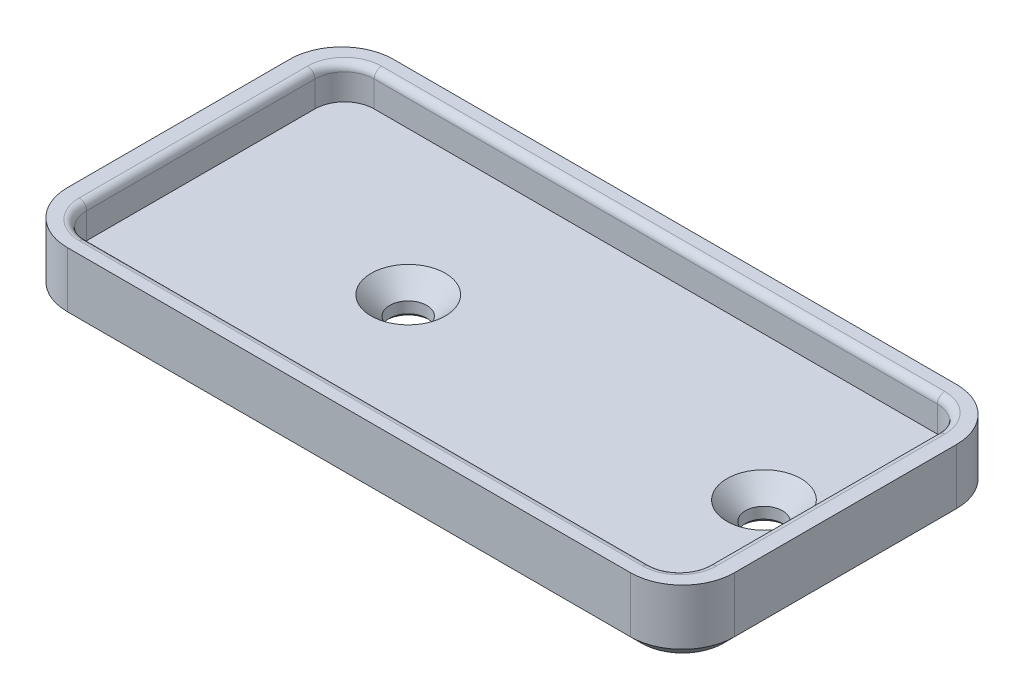
ISO-10303-21;
HEADER;
FILE_DESCRIPTION(('STEP AP214'),'2;1');
FILE_NAME('part.step','',(''),(''),'','','');
FILE_SCHEMA(('AUTOMOTIVE_DESIGN { 1 0 10303 214 1 1 1 1 }'));
ENDSEC;
DATA;
#1=APPLICATION_CONTEXT('core data for automotive mechanical design processes');
#2=APPLICATION_PROTOCOL_DEFINITION('international standard','automotive_design',2000,#1);
#3=PRODUCT_CONTEXT('',#1,'mechanical');
#4=PRODUCT('Part','Part','',(#3));
#5=PRODUCT_RELATED_PRODUCT_CATEGORY('part','',(#4));
#6=PRODUCT_DEFINITION_FORMATION('','',#4);
#7=PRODUCT_DEFINITION_CONTEXT('part definition',#1,'design');
#8=PRODUCT_DEFINITION('design','',#6,#7);
#9=PRODUCT_DEFINITION_SHAPE('','',#8);
#10=(LENGTH_UNIT() NAMED_UNIT(*) SI_UNIT(.MILLI.,.METRE.));
#11=(NAMED_UNIT(*) PLANE_ANGLE_UNIT() SI_UNIT($,.RADIAN.));
#12=(NAMED_UNIT(*) SI_UNIT($,.STERADIAN.) SOLID_ANGLE_UNIT());
#13=UNCERTAINTY_MEASURE_WITH_UNIT(LENGTH_MEASURE(1.E-05),#10,'distance_accuracy_value','');
#14=(GEOMETRIC_REPRESENTATION_CONTEXT(3) GLOBAL_UNCERTAINTY_ASSIGNED_CONTEXT((#13)) GLOBAL_UNIT_ASSIGNED_CONTEXT((#10,
#11,#12)) REPRESENTATION_CONTEXT('',''));
#15=CARTESIAN_POINT('',(0.,0.,0.));
#16=DIRECTION('',(0.,0.,1.));
#17=DIRECTION('',(1.,0.,0.));
#18=AXIS2_PLACEMENT_3D('',#15,#16,#17);
#19=CARTESIAN_POINT('',(45.,9.,22.));
#20=DIRECTION('',(-1.,0.,0.));
#21=DIRECTION('',(0.,0.,1.));
#22=AXIS2_PLACEMENT_3D('',#19,#20,#21);
#23=PLANE('',#22);
#24=DIRECTION('',(0.,-1.,0.));
#25=VECTOR('',#24,1.);
#26=CARTESIAN_POINT('',(45.,9.,15.));
#27=LINE('',#26,#25);
#28=CARTESIAN_POINT('',(45.,9.,15.));
#29=VERTEX_POINT('',#28);
#30=CARTESIAN_POINT('',(45.,1.5,15.));
#31=VERTEX_POINT('',#30);
#32=EDGE_CURVE('E252',#29,#31,#27,.T.);
#33=ORIENTED_EDGE('',*,*,#32,.T.);
#34=DIRECTION('',(0.,0.,-1.));
#35=VECTOR('',#34,1.);
#36=CARTESIAN_POINT('',(45.,1.5,-15.));
#37=LINE('',#36,#35);
#38=CARTESIAN_POINT('',(45.,1.5,-15.));
#39=VERTEX_POINT('',#38);
#40=EDGE_CURVE('E381',#31,#39,#37,.T.);
#41=ORIENTED_EDGE('',*,*,#40,.T.);
#42=DIRECTION('',(0.,-1.,0.));
#43=VECTOR('',#42,1.);
#44=CARTESIAN_POINT('',(45.,9.,-15.));
#45=LINE('',#44,#43);
#46=CARTESIAN_POINT('',(45.,9.,-15.));
#47=VERTEX_POINT('',#46);
#48=EDGE_CURVE('E254',#39,#47,#45,.F.);
#49=ORIENTED_EDGE('',*,*,#48,.T.);
#50=DIRECTION('',(0.,0.,-1.));
#51=VECTOR('',#50,1.);
#52=CARTESIAN_POINT('',(45.,9.,22.));
#53=LINE('',#52,#51);
#54=EDGE_CURVE('E803',#29,#47,#53,.T.);
#55=ORIENTED_EDGE('',*,*,#54,.F.);
#56=EDGE_LOOP('',(#33,#41,#49,#55));
#57=FACE_BOUND('',#56,.T.);
#58=ADVANCED_FACE('F45',(#57),#23,.F.);
#59=CARTESIAN_POINT('',(-45.,9.,-22.));
#60=DIRECTION('',(0.,0.,1.));
#61=DIRECTION('',(1.,0.,0.));
#62=AXIS2_PLACEMENT_3D('',#59,#60,#61);
#63=PLANE('',#62);
#64=DIRECTION('',(0.,-1.,0.));
#65=VECTOR('',#64,1.);
#66=CARTESIAN_POINT('',(38.,9.,-22.));
#67=LINE('',#66,#65);
#68=CARTESIAN_POINT('',(38.,9.,-22.));
#69=VERTEX_POINT('',#68);
#70=CARTESIAN_POINT('',(38.,1.5,-22.));
#71=VERTEX_POINT('',#70);
#72=EDGE_CURVE('E235',#69,#71,#67,.T.);
#73=ORIENTED_EDGE('',*,*,#72,.T.);
#74=DIRECTION('',(-1.,0.,0.));
#75=VECTOR('',#74,1.);
#76=CARTESIAN_POINT('',(-38.,1.5,-22.));
#77=LINE('',#76,#75);
#78=CARTESIAN_POINT('',(-38.,1.5,-22.));
#79=VERTEX_POINT('',#78);
#80=EDGE_CURVE('E377',#71,#79,#77,.T.);
#81=ORIENTED_EDGE('',*,*,#80,.T.);
#82=DIRECTION('',(0.,-1.,0.));
#83=VECTOR('',#82,1.);
#84=CARTESIAN_POINT('',(-38.,9.,-22.));
#85=LINE('',#84,#83);
#86=CARTESIAN_POINT('',(-38.,9.,-22.));
#87=VERTEX_POINT('',#86);
#88=EDGE_CURVE('E238',#79,#87,#85,.F.);
#89=ORIENTED_EDGE('',*,*,#88,.T.);
#90=DIRECTION('',(-1.,0.,0.));
#91=VECTOR('',#90,1.);
#92=CARTESIAN_POINT('',(-45.,9.,-22.));
#93=LINE('',#92,#91);
#94=EDGE_CURVE('E216',#69,#87,#93,.T.);
#95=ORIENTED_EDGE('',*,*,#94,.F.);
#96=EDGE_LOOP('',(#73,#81,#89,#95));
#97=FACE_BOUND('',#96,.T.);
#98=ADVANCED_FACE('F448',(#97),#63,.F.);
#99=CARTESIAN_POINT('',(-45.,9.,22.));
#100=DIRECTION('',(1.,0.,0.));
#101=DIRECTION('',(0.,0.,-1.));
#102=AXIS2_PLACEMENT_3D('',#99,#100,#101);
#103=PLANE('',#102);
#104=DIRECTION('',(0.,-1.,0.));
#105=VECTOR('',#104,1.);
#106=CARTESIAN_POINT('',(-45.,9.,-15.));
#107=LINE('',#106,#105);
#108=CARTESIAN_POINT('',(-45.,9.,-15.));
#109=VERTEX_POINT('',#108);
#110=CARTESIAN_POINT('',(-45.,1.5,-15.));
#111=VERTEX_POINT('',#110);
#112=EDGE_CURVE('E226',#109,#111,#107,.T.);
#113=ORIENTED_EDGE('',*,*,#112,.T.);
#114=DIRECTION('',(0.,0.,1.));
#115=VECTOR('',#114,1.);
#116=CARTESIAN_POINT('',(-45.,1.5,15.));
#117=LINE('',#116,#115);
#118=CARTESIAN_POINT('',(-45.,1.5,15.));
#119=VERTEX_POINT('',#118);
#120=EDGE_CURVE('E374',#111,#119,#117,.T.);
#121=ORIENTED_EDGE('',*,*,#120,.T.);
#122=DIRECTION('',(0.,-1.,0.));
#123=VECTOR('',#122,1.);
#124=CARTESIAN_POINT('',(-45.,9.,15.));
#125=LINE('',#124,#123);
#126=CARTESIAN_POINT('',(-45.,9.,15.));
#127=VERTEX_POINT('',#126);
#128=EDGE_CURVE('E229',#119,#127,#125,.F.);
#129=ORIENTED_EDGE('',*,*,#128,.T.);
#130=DIRECTION('',(0.,0.,1.));
#131=VECTOR('',#130,1.);
#132=CARTESIAN_POINT('',(-45.,9.,22.));
#133=LINE('',#132,#131);
#134=EDGE_CURVE('E213',#109,#127,#133,.T.);
#135=ORIENTED_EDGE('',*,*,#134,.F.);
#136=EDGE_LOOP('',(#113,#121,#129,#135));
#137=FACE_BOUND('',#136,.T.);
#138=ADVANCED_FACE('F225',(#137),#103,.F.);
#139=CARTESIAN_POINT('',(-45.,9.,22.));
#140=DIRECTION('',(0.,0.,-1.));
#141=DIRECTION('',(-1.,0.,0.));
#142=AXIS2_PLACEMENT_3D('',#139,#140,#141);
#143=PLANE('',#142);
#144=DIRECTION('',(0.,-1.,0.));
#145=VECTOR('',#144,1.);
#146=CARTESIAN_POINT('',(-38.,9.,22.));
#147=LINE('',#146,#145);
#148=CARTESIAN_POINT('',(-38.,9.,22.));
#149=VERTEX_POINT('',#148);
#150=CARTESIAN_POINT('',(-38.,1.5,22.));
#151=VERTEX_POINT('',#150);
#152=EDGE_CURVE('E250',#149,#151,#147,.T.);
#153=ORIENTED_EDGE('',*,*,#152,.T.);
#154=DIRECTION('',(1.,0.,0.));
#155=VECTOR('',#154,1.);
#156=CARTESIAN_POINT('',(38.,1.5,22.));
#157=LINE('',#156,#155);
#158=CARTESIAN_POINT('',(38.,1.5,22.));
#159=VERTEX_POINT('',#158);
#160=EDGE_CURVE('E61',#151,#159,#157,.T.);
#161=ORIENTED_EDGE('',*,*,#160,.T.);
#162=DIRECTION('',(0.,-1.,0.));
#163=VECTOR('',#162,1.);
#164=CARTESIAN_POINT('',(38.,9.,22.));
#165=LINE('',#164,#163);
#166=CARTESIAN_POINT('',(38.,9.,22.));
#167=VERTEX_POINT('',#166);
#168=EDGE_CURVE('E220',#159,#167,#165,.F.);
#169=ORIENTED_EDGE('',*,*,#168,.T.);
#170=DIRECTION('',(1.,0.,0.));
#171=VECTOR('',#170,1.);
#172=CARTESIAN_POINT('',(-45.,9.,22.));
#173=LINE('',#172,#171);
#174=EDGE_CURVE('E230',#149,#167,#173,.T.);
#175=ORIENTED_EDGE('',*,*,#174,.F.);
#176=EDGE_LOOP('',(#153,#161,#169,#175));
#177=FACE_BOUND('',#176,.T.);
#178=ADVANCED_FACE('F619',(#177),#143,.F.);
#179=CARTESIAN_POINT('',(0.,9.,0.));
#180=DIRECTION('',(0.,-1.,0.));
#181=DIRECTION('',(0.,0.,-1.));
#182=AXIS2_PLACEMENT_3D('',#179,#180,#181);
#183=PLANE('',#182);
#184=DIRECTION('',(-1.,0.,0.));
#185=VECTOR('',#184,1.);
#186=CARTESIAN_POINT('',(0.,9.,-20.4));
#187=LINE('',#186,#185);
#188=CARTESIAN_POINT('',(-38.,9.,-20.4));
#189=VERTEX_POINT('',#188);
#190=CARTESIAN_POINT('',(38.,9.,-20.4));
#191=VERTEX_POINT('',#190);
#192=EDGE_CURVE('E296',#189,#191,#187,.F.);
#193=ORIENTED_EDGE('',*,*,#192,.T.);
#194=CARTESIAN_POINT('',(38.,9.,-15.4));
#195=DIRECTION('',(0.,-1.,0.));
#196=DIRECTION('',(0.,0.,-1.));
#197=AXIS2_PLACEMENT_3D('',#194,#195,#196);
#198=CIRCLE('',#197,5.);
#199=CARTESIAN_POINT('',(43.,9.,-15.4));
#200=VERTEX_POINT('',#199);
#201=EDGE_CURVE('E310',#191,#200,#198,.T.);
#202=ORIENTED_EDGE('',*,*,#201,.T.);
#203=DIRECTION('',(0.,0.,-1.));
#204=VECTOR('',#203,1.);
#205=CARTESIAN_POINT('',(43.,9.,0.));
#206=LINE('',#205,#204);
#207=CARTESIAN_POINT('',(43.,9.,15.4));
#208=VERTEX_POINT('',#207);
#209=EDGE_CURVE('E308',#200,#208,#206,.F.);
#210=ORIENTED_EDGE('',*,*,#209,.T.);
#211=CARTESIAN_POINT('',(38.,9.,15.4));
#212=DIRECTION('',(0.,-1.,0.));
#213=DIRECTION('',(0.,0.,-1.));
#214=AXIS2_PLACEMENT_3D('',#211,#212,#213);
#215=CIRCLE('',#214,5.);
#216=CARTESIAN_POINT('',(38.,9.,20.4));
#217=VERTEX_POINT('',#216);
#218=EDGE_CURVE('E306',#208,#217,#215,.T.);
#219=ORIENTED_EDGE('',*,*,#218,.T.);
#220=DIRECTION('',(1.,0.,0.));
#221=VECTOR('',#220,1.);
#222=CARTESIAN_POINT('',(0.,9.,20.4));
#223=LINE('',#222,#221);
#224=CARTESIAN_POINT('',(-38.,9.,20.4));
#225=VERTEX_POINT('',#224);
#226=EDGE_CURVE('E304',#217,#225,#223,.F.);
#227=ORIENTED_EDGE('',*,*,#226,.T.);
#228=CARTESIAN_POINT('',(-38.,9.,15.4));
#229=DIRECTION('',(0.,-1.,0.));
#230=DIRECTION('',(0.,0.,-1.));
#231=AXIS2_PLACEMENT_3D('',#228,#229,#230);
#232=CIRCLE('',#231,5.);
#233=CARTESIAN_POINT('',(-43.,9.,15.4));
#234=VERTEX_POINT('',#233);
#235=EDGE_CURVE('E302',#225,#234,#232,.T.);
#236=ORIENTED_EDGE('',*,*,#235,.T.);
#237=DIRECTION('',(0.,0.,1.));
#238=VECTOR('',#237,1.);
#239=CARTESIAN_POINT('',(-43.,9.,0.));
#240=LINE('',#239,#238);
#241=CARTESIAN_POINT('',(-43.,9.,-15.4));
#242=VERTEX_POINT('',#241);
#243=EDGE_CURVE('E300',#234,#242,#240,.F.);
#244=ORIENTED_EDGE('',*,*,#243,.T.);
#245=CARTESIAN_POINT('',(-38.,9.,-15.4));
#246=DIRECTION('',(0.,-1.,0.));
#247=DIRECTION('',(0.,0.,-1.));
#248=AXIS2_PLACEMENT_3D('',#245,#246,#247);
#249=CIRCLE('',#248,5.);
#250=EDGE_CURVE('E298',#242,#189,#249,.T.);
#251=ORIENTED_EDGE('',*,*,#250,.T.);
#252=EDGE_LOOP('',(#193,#202,#210,#219,#227,#236,#244,#251));
#253=FACE_BOUND('',#252,.T.);
#254=ORIENTED_EDGE('',*,*,#94,.T.);
#255=CARTESIAN_POINT('',(-38.,9.,-15.));
#256=DIRECTION('',(0.,-1.,0.));
#257=DIRECTION('',(0.,0.,-1.));
#258=AXIS2_PLACEMENT_3D('',#255,#256,#257);
#259=CIRCLE('',#258,7.);
#260=EDGE_CURVE('E210',#87,#109,#259,.F.);
#261=ORIENTED_EDGE('',*,*,#260,.T.);
#262=ORIENTED_EDGE('',*,*,#134,.T.);
#263=CARTESIAN_POINT('',(-38.,9.,15.));
#264=DIRECTION('',(0.,-1.,0.));
#265=DIRECTION('',(0.,0.,-1.));
#266=AXIS2_PLACEMENT_3D('',#263,#264,#265);
#267=CIRCLE('',#266,7.);
#268=EDGE_CURVE('E221',#127,#149,#267,.F.);
#269=ORIENTED_EDGE('',*,*,#268,.T.);
#270=ORIENTED_EDGE('',*,*,#174,.T.);
#271=CARTESIAN_POINT('',(38.,9.,15.));
#272=DIRECTION('',(0.,-1.,0.));
#273=DIRECTION('',(0.,0.,-1.));
#274=AXIS2_PLACEMENT_3D('',#271,#272,#273);
#275=CIRCLE('',#274,7.);
#276=EDGE_CURVE('E244',#167,#29,#275,.F.);
#277=ORIENTED_EDGE('',*,*,#276,.T.);
#278=ORIENTED_EDGE('',*,*,#54,.T.);
#279=CARTESIAN_POINT('',(38.,9.,-15.));
#280=DIRECTION('',(0.,-1.,0.));
#281=DIRECTION('',(0.,0.,-1.));
#282=AXIS2_PLACEMENT_3D('',#279,#280,#281);
#283=CIRCLE('',#282,7.);
#284=EDGE_CURVE('E246',#47,#69,#283,.F.);
#285=ORIENTED_EDGE('',*,*,#284,.T.);
#286=EDGE_LOOP('',(#254,#261,#262,#269,#270,#277,#278,#285));
#287=FACE_BOUND('',#286,.T.);
#288=ADVANCED_FACE('F212',(#253,#287),#183,.F.);
#289=CARTESIAN_POINT('',(0.,0.,0.));
#290=DIRECTION('',(0.,-1.,0.));
#291=DIRECTION('',(0.,0.,-1.));
#292=AXIS2_PLACEMENT_3D('',#289,#290,#291);
#293=PLANE('',#292);
#294=CARTESIAN_POINT('',(34.,0.,0.));
#295=DIRECTION('',(0.,-1.,0.));
#296=DIRECTION('',(0.,0.,-1.));
#297=AXIS2_PLACEMENT_3D('',#294,#295,#296);
#298=CIRCLE('',#297,3.);
#299=CARTESIAN_POINT('',(34.,0.,-3.));
#300=VERTEX_POINT('',#299);
#301=EDGE_CURVE('E54',#300,#300,#298,.F.);
#302=ORIENTED_EDGE('',*,*,#301,.T.);
#303=EDGE_LOOP('',(#302));
#304=FACE_BOUND('',#303,.T.);
#305=CARTESIAN_POINT('',(-14.,0.,0.));
#306=DIRECTION('',(0.,-1.,0.));
#307=DIRECTION('',(0.,0.,-1.));
#308=AXIS2_PLACEMENT_3D('',#305,#306,#307);
#309=CIRCLE('',#308,3.);
#310=CARTESIAN_POINT('',(-14.,0.,-2.99999999999993));
#311=VERTEX_POINT('',#310);
#312=EDGE_CURVE('E409',#311,#311,#309,.F.);
#313=ORIENTED_EDGE('',*,*,#312,.T.);
#314=EDGE_LOOP('',(#313));
#315=FACE_BOUND('',#314,.T.);
#316=DIRECTION('',(-1.,0.,0.));
#317=VECTOR('',#316,1.);
#318=CARTESIAN_POINT('',(-38.,0.,20.5));
#319=LINE('',#318,#317);
#320=CARTESIAN_POINT('',(38.,0.,20.5));
#321=VERTEX_POINT('',#320);
#322=CARTESIAN_POINT('',(-38.,0.,20.5));
#323=VERTEX_POINT('',#322);
#324=EDGE_CURVE('E330',#321,#323,#319,.T.);
#325=ORIENTED_EDGE('',*,*,#324,.T.);
#326=CARTESIAN_POINT('',(-38.,0.,15.));
#327=DIRECTION('',(0.,-1.,0.));
#328=DIRECTION('',(0.,0.,-1.));
#329=AXIS2_PLACEMENT_3D('',#326,#327,#328);
#330=CIRCLE('',#329,5.5);
#331=CARTESIAN_POINT('',(-43.5,0.,15.));
#332=VERTEX_POINT('',#331);
#333=EDGE_CURVE('E368',#323,#332,#330,.T.);
#334=ORIENTED_EDGE('',*,*,#333,.T.);
#335=DIRECTION('',(0.,0.,-1.));
#336=VECTOR('',#335,1.);
#337=CARTESIAN_POINT('',(-43.5,0.,-15.));
#338=LINE('',#337,#336);
#339=CARTESIAN_POINT('',(-43.5,0.,-15.));
#340=VERTEX_POINT('',#339);
#341=EDGE_CURVE('E366',#332,#340,#338,.T.);
#342=ORIENTED_EDGE('',*,*,#341,.T.);
#343=CARTESIAN_POINT('',(-38.,0.,-15.));
#344=DIRECTION('',(0.,-1.,0.));
#345=DIRECTION('',(0.,0.,-1.));
#346=AXIS2_PLACEMENT_3D('',#343,#344,#345);
#347=CIRCLE('',#346,5.5);
#348=CARTESIAN_POINT('',(-38.,0.,-20.5));
#349=VERTEX_POINT('',#348);
#350=EDGE_CURVE('E364',#340,#349,#347,.T.);
#351=ORIENTED_EDGE('',*,*,#350,.T.);
#352=DIRECTION('',(1.,0.,0.));
#353=VECTOR('',#352,1.);
#354=CARTESIAN_POINT('',(38.,0.,-20.5));
#355=LINE('',#354,#353);
#356=CARTESIAN_POINT('',(38.,0.,-20.5));
#357=VERTEX_POINT('',#356);
#358=EDGE_CURVE('E362',#349,#357,#355,.T.);
#359=ORIENTED_EDGE('',*,*,#358,.T.);
#360=CARTESIAN_POINT('',(38.,0.,-15.));
#361=DIRECTION('',(0.,-1.,0.));
#362=DIRECTION('',(0.,0.,-1.));
#363=AXIS2_PLACEMENT_3D('',#360,#361,#362);
#364=CIRCLE('',#363,5.5);
#365=CARTESIAN_POINT('',(43.5,0.,-15.));
#366=VERTEX_POINT('',#365);
#367=EDGE_CURVE('E360',#357,#366,#364,.T.);
#368=ORIENTED_EDGE('',*,*,#367,.T.);
#369=DIRECTION('',(0.,0.,1.));
#370=VECTOR('',#369,1.);
#371=CARTESIAN_POINT('',(43.5,0.,15.));
#372=LINE('',#371,#370);
#373=CARTESIAN_POINT('',(43.5,0.,15.));
#374=VERTEX_POINT('',#373);
#375=EDGE_CURVE('E358',#366,#374,#372,.T.);
#376=ORIENTED_EDGE('',*,*,#375,.T.);
#377=CARTESIAN_POINT('',(38.,0.,15.));
#378=DIRECTION('',(0.,-1.,0.));
#379=DIRECTION('',(0.,0.,-1.));
#380=AXIS2_PLACEMENT_3D('',#377,#378,#379);
#381=CIRCLE('',#380,5.5);
#382=EDGE_CURVE('E356',#374,#321,#381,.T.);
#383=ORIENTED_EDGE('',*,*,#382,.T.);
#384=EDGE_LOOP('',(#325,#334,#342,#351,#359,#368,#376,#383));
#385=FACE_BOUND('',#384,.T.);
#386=ADVANCED_FACE('F414',(#304,#315,#385),#293,.T.);
#387=CARTESIAN_POINT('',(-38.,9.,-15.));
#388=DIRECTION('',(0.,-1.,0.));
#389=DIRECTION('',(0.,0.,-1.));
#390=AXIS2_PLACEMENT_3D('',#387,#388,#389);
#391=CYLINDRICAL_SURFACE('',#390,7.);
#392=ORIENTED_EDGE('',*,*,#88,.F.);
#393=CARTESIAN_POINT('',(-38.,1.5,-15.));
#394=DIRECTION('',(0.,-1.,0.));
#395=DIRECTION('',(0.,0.,-1.));
#396=AXIS2_PLACEMENT_3D('',#393,#394,#395);
#397=CIRCLE('',#396,7.);
#398=EDGE_CURVE('E234',#79,#111,#397,.F.);
#399=ORIENTED_EDGE('',*,*,#398,.T.);
#400=ORIENTED_EDGE('',*,*,#112,.F.);
#401=ORIENTED_EDGE('',*,*,#260,.F.);
#402=EDGE_LOOP('',(#392,#399,#400,#401));
#403=FACE_BOUND('',#402,.T.);
#404=ADVANCED_FACE('F232',(#403),#391,.T.);
#405=CARTESIAN_POINT('',(-38.,9.,15.));
#406=DIRECTION('',(0.,-1.,0.));
#407=DIRECTION('',(0.,0.,-1.));
#408=AXIS2_PLACEMENT_3D('',#405,#406,#407);
#409=CYLINDRICAL_SURFACE('',#408,7.);
#410=ORIENTED_EDGE('',*,*,#128,.F.);
#411=CARTESIAN_POINT('',(-38.,1.5,15.));
#412=DIRECTION('',(0.,-1.,0.));
#413=DIRECTION('',(0.,0.,-1.));
#414=AXIS2_PLACEMENT_3D('',#411,#412,#413);
#415=CIRCLE('',#414,7.);
#416=EDGE_CURVE('E371',#119,#151,#415,.F.);
#417=ORIENTED_EDGE('',*,*,#416,.T.);
#418=ORIENTED_EDGE('',*,*,#152,.F.);
#419=ORIENTED_EDGE('',*,*,#268,.F.);
#420=EDGE_LOOP('',(#410,#417,#418,#419));
#421=FACE_BOUND('',#420,.T.);
#422=ADVANCED_FACE('F460',(#421),#409,.T.);
#423=CARTESIAN_POINT('',(38.,9.,-15.));
#424=DIRECTION('',(0.,-1.,0.));
#425=DIRECTION('',(0.,0.,-1.));
#426=AXIS2_PLACEMENT_3D('',#423,#424,#425);
#427=CYLINDRICAL_SURFACE('',#426,7.);
#428=ORIENTED_EDGE('',*,*,#48,.F.);
#429=CARTESIAN_POINT('',(38.,1.5,-15.));
#430=DIRECTION('',(0.,-1.,0.));
#431=DIRECTION('',(0.,0.,-1.));
#432=AXIS2_PLACEMENT_3D('',#429,#430,#431);
#433=CIRCLE('',#432,7.);
#434=EDGE_CURVE('E379',#39,#71,#433,.F.);
#435=ORIENTED_EDGE('',*,*,#434,.T.);
#436=ORIENTED_EDGE('',*,*,#72,.F.);
#437=ORIENTED_EDGE('',*,*,#284,.F.);
#438=EDGE_LOOP('',(#428,#435,#436,#437));
#439=FACE_BOUND('',#438,.T.);
#440=ADVANCED_FACE('F463',(#439),#427,.T.);
#441=CARTESIAN_POINT('',(38.,9.,15.));
#442=DIRECTION('',(0.,-1.,0.));
#443=DIRECTION('',(0.,0.,-1.));
#444=AXIS2_PLACEMENT_3D('',#441,#442,#443);
#445=CYLINDRICAL_SURFACE('',#444,7.);
#446=ORIENTED_EDGE('',*,*,#168,.F.);
#447=CARTESIAN_POINT('',(38.,1.5,15.));
#448=DIRECTION('',(0.,-1.,0.));
#449=DIRECTION('',(0.,0.,-1.));
#450=AXIS2_PLACEMENT_3D('',#447,#448,#449);
#451=CIRCLE('',#450,7.);
#452=EDGE_CURVE('E68',#159,#31,#451,.F.);
#453=ORIENTED_EDGE('',*,*,#452,.T.);
#454=ORIENTED_EDGE('',*,*,#32,.F.);
#455=ORIENTED_EDGE('',*,*,#276,.F.);
#456=EDGE_LOOP('',(#446,#453,#454,#455));
#457=FACE_BOUND('',#456,.T.);
#458=ADVANCED_FACE('F467',(#457),#445,.T.);
#459=CARTESIAN_POINT('',(42.,4.5,19.4));
#460=DIRECTION('',(1.,0.,0.));
#461=DIRECTION('',(0.,0.,-1.));
#462=AXIS2_PLACEMENT_3D('',#459,#460,#461);
#463=PLANE('',#462);
#464=DIRECTION('',(0.,1.,0.));
#465=VECTOR('',#464,1.);
#466=CARTESIAN_POINT('',(42.,9.,15.4));
#467=LINE('',#466,#465);
#468=CARTESIAN_POINT('',(42.,4.5,15.4));
#469=VERTEX_POINT('',#468);
#470=CARTESIAN_POINT('',(42.,8.,15.4));
#471=VERTEX_POINT('',#470);
#472=EDGE_CURVE('E288',#469,#471,#467,.T.);
#473=ORIENTED_EDGE('',*,*,#472,.T.);
#474=DIRECTION('',(0.,0.,-1.));
#475=VECTOR('',#474,1.);
#476=CARTESIAN_POINT('',(42.,8.,19.4));
#477=LINE('',#476,#475);
#478=CARTESIAN_POINT('',(42.,8.,-15.4));
#479=VERTEX_POINT('',#478);
#480=EDGE_CURVE('E316',#471,#479,#477,.T.);
#481=ORIENTED_EDGE('',*,*,#480,.T.);
#482=DIRECTION('',(0.,1.,0.));
#483=VECTOR('',#482,1.);
#484=CARTESIAN_POINT('',(42.,4.5,-15.4));
#485=LINE('',#484,#483);
#486=CARTESIAN_POINT('',(42.,4.5,-15.4));
#487=VERTEX_POINT('',#486);
#488=EDGE_CURVE('E286',#479,#487,#485,.F.);
#489=ORIENTED_EDGE('',*,*,#488,.T.);
#490=DIRECTION('',(0.,0.,-1.));
#491=VECTOR('',#490,1.);
#492=CARTESIAN_POINT('',(42.,4.5,19.4));
#493=LINE('',#492,#491);
#494=EDGE_CURVE('E354',#469,#487,#493,.T.);
#495=ORIENTED_EDGE('',*,*,#494,.F.);
#496=EDGE_LOOP('',(#473,#481,#489,#495));
#497=FACE_BOUND('',#496,.T.);
#498=ADVANCED_FACE('F470',(#497),#463,.F.);
#499=CARTESIAN_POINT('',(-42.,4.5,19.4));
#500=DIRECTION('',(0.,0.,1.));
#501=DIRECTION('',(1.,0.,0.));
#502=AXIS2_PLACEMENT_3D('',#499,#500,#501);
#503=PLANE('',#502);
#504=DIRECTION('',(0.,1.,0.));
#505=VECTOR('',#504,1.);
#506=CARTESIAN_POINT('',(-38.,9.,19.4));
#507=LINE('',#506,#505);
#508=CARTESIAN_POINT('',(-38.,4.5,19.4));
#509=VERTEX_POINT('',#508);
#510=CARTESIAN_POINT('',(-38.,8.,19.4));
#511=VERTEX_POINT('',#510);
#512=EDGE_CURVE('E270',#509,#511,#507,.T.);
#513=ORIENTED_EDGE('',*,*,#512,.T.);
#514=DIRECTION('',(1.,0.,0.));
#515=VECTOR('',#514,1.);
#516=CARTESIAN_POINT('',(-42.,8.,19.4));
#517=LINE('',#516,#515);
#518=CARTESIAN_POINT('',(38.,8.,19.4));
#519=VERTEX_POINT('',#518);
#520=EDGE_CURVE('E320',#511,#519,#517,.T.);
#521=ORIENTED_EDGE('',*,*,#520,.T.);
#522=DIRECTION('',(0.,1.,0.));
#523=VECTOR('',#522,1.);
#524=CARTESIAN_POINT('',(38.,4.5,19.4));
#525=LINE('',#524,#523);
#526=CARTESIAN_POINT('',(38.,4.5,19.4));
#527=VERTEX_POINT('',#526);
#528=EDGE_CURVE('E268',#519,#527,#525,.F.);
#529=ORIENTED_EDGE('',*,*,#528,.T.);
#530=DIRECTION('',(1.,0.,0.));
#531=VECTOR('',#530,1.);
#532=CARTESIAN_POINT('',(-42.,4.5,19.4));
#533=LINE('',#532,#531);
#534=EDGE_CURVE('E805',#509,#527,#533,.T.);
#535=ORIENTED_EDGE('',*,*,#534,.F.);
#536=EDGE_LOOP('',(#513,#521,#529,#535));
#537=FACE_BOUND('',#536,.T.);
#538=ADVANCED_FACE('F818',(#537),#503,.F.);
#539=CARTESIAN_POINT('',(-42.,4.5,19.4));
#540=DIRECTION('',(-1.,0.,0.));
#541=DIRECTION('',(0.,0.,1.));
#542=AXIS2_PLACEMENT_3D('',#539,#540,#541);
#543=PLANE('',#542);
#544=DIRECTION('',(0.,1.,0.));
#545=VECTOR('',#544,1.);
#546=CARTESIAN_POINT('',(-42.,9.,-15.4));
#547=LINE('',#546,#545);
#548=CARTESIAN_POINT('',(-42.,4.5,-15.4));
#549=VERTEX_POINT('',#548);
#550=CARTESIAN_POINT('',(-42.,8.,-15.4));
#551=VERTEX_POINT('',#550);
#552=EDGE_CURVE('E273',#549,#551,#547,.T.);
#553=ORIENTED_EDGE('',*,*,#552,.T.);
#554=DIRECTION('',(0.,0.,1.));
#555=VECTOR('',#554,1.);
#556=CARTESIAN_POINT('',(-42.,8.,19.4));
#557=LINE('',#556,#555);
#558=CARTESIAN_POINT('',(-42.,8.,15.4));
#559=VERTEX_POINT('',#558);
#560=EDGE_CURVE('E324',#551,#559,#557,.T.);
#561=ORIENTED_EDGE('',*,*,#560,.T.);
#562=DIRECTION('',(0.,1.,0.));
#563=VECTOR('',#562,1.);
#564=CARTESIAN_POINT('',(-42.,4.5,15.4));
#565=LINE('',#564,#563);
#566=CARTESIAN_POINT('',(-42.,4.5,15.4));
#567=VERTEX_POINT('',#566);
#568=EDGE_CURVE('E276',#559,#567,#565,.F.);
#569=ORIENTED_EDGE('',*,*,#568,.T.);
#570=DIRECTION('',(0.,0.,1.));
#571=VECTOR('',#570,1.);
#572=CARTESIAN_POINT('',(-42.,4.5,19.4));
#573=LINE('',#572,#571);
#574=EDGE_CURVE('E813',#549,#567,#573,.T.);
#575=ORIENTED_EDGE('',*,*,#574,.F.);
#576=EDGE_LOOP('',(#553,#561,#569,#575));
#577=FACE_BOUND('',#576,.T.);
#578=ADVANCED_FACE('F609',(#577),#543,.F.);
#579=CARTESIAN_POINT('',(-42.,4.5,-19.4));
#580=DIRECTION('',(0.,0.,-1.));
#581=DIRECTION('',(-1.,0.,0.));
#582=AXIS2_PLACEMENT_3D('',#579,#580,#581);
#583=PLANE('',#582);
#584=DIRECTION('',(0.,1.,0.));
#585=VECTOR('',#584,1.);
#586=CARTESIAN_POINT('',(38.,9.,-19.4));
#587=LINE('',#586,#585);
#588=CARTESIAN_POINT('',(38.,4.5,-19.4));
#589=VERTEX_POINT('',#588);
#590=CARTESIAN_POINT('',(38.,8.,-19.4));
#591=VERTEX_POINT('',#590);
#592=EDGE_CURVE('E293',#589,#591,#587,.T.);
#593=ORIENTED_EDGE('',*,*,#592,.T.);
#594=DIRECTION('',(-1.,0.,0.));
#595=VECTOR('',#594,1.);
#596=CARTESIAN_POINT('',(-42.,8.,-19.4));
#597=LINE('',#596,#595);
#598=CARTESIAN_POINT('',(-38.,8.,-19.4));
#599=VERTEX_POINT('',#598);
#600=EDGE_CURVE('E328',#591,#599,#597,.T.);
#601=ORIENTED_EDGE('',*,*,#600,.T.);
#602=DIRECTION('',(0.,1.,0.));
#603=VECTOR('',#602,1.);
#604=CARTESIAN_POINT('',(-38.,4.5,-19.4));
#605=LINE('',#604,#603);
#606=CARTESIAN_POINT('',(-38.,4.5,-19.4));
#607=VERTEX_POINT('',#606);
#608=EDGE_CURVE('E291',#599,#607,#605,.F.);
#609=ORIENTED_EDGE('',*,*,#608,.T.);
#610=DIRECTION('',(-1.,0.,0.));
#611=VECTOR('',#610,1.);
#612=CARTESIAN_POINT('',(-42.,4.5,-19.4));
#613=LINE('',#612,#611);
#614=EDGE_CURVE('E815',#589,#607,#613,.T.);
#615=ORIENTED_EDGE('',*,*,#614,.F.);
#616=EDGE_LOOP('',(#593,#601,#609,#615));
#617=FACE_BOUND('',#616,.T.);
#618=ADVANCED_FACE('F596',(#617),#583,.F.);
#619=CARTESIAN_POINT('',(0.,4.5,0.));
#620=DIRECTION('',(0.,-1.,0.));
#621=DIRECTION('',(0.,0.,-1.));
#622=AXIS2_PLACEMENT_3D('',#619,#620,#621);
#623=PLANE('',#622);
#624=CARTESIAN_POINT('',(-14.,4.5,0.));
#625=DIRECTION('',(0.,-1.,0.));
#626=DIRECTION('',(0.,0.,-1.));
#627=AXIS2_PLACEMENT_3D('',#624,#625,#626);
#628=CIRCLE('',#627,5.00000000000002);
#629=CARTESIAN_POINT('',(-14.,4.5,-4.99999999999995));
#630=VERTEX_POINT('',#629);
#631=EDGE_CURVE('E262',#630,#630,#628,.T.);
#632=ORIENTED_EDGE('',*,*,#631,.T.);
#633=EDGE_LOOP('',(#632));
#634=FACE_BOUND('',#633,.T.);
#635=CARTESIAN_POINT('',(34.,4.5,0.));
#636=DIRECTION('',(0.,-1.,0.));
#637=DIRECTION('',(0.,0.,-1.));
#638=AXIS2_PLACEMENT_3D('',#635,#636,#637);
#639=CIRCLE('',#638,5.00000000000002);
#640=CARTESIAN_POINT('',(34.,4.5,-5.00000000000002));
#641=VERTEX_POINT('',#640);
#642=EDGE_CURVE('E259',#641,#641,#639,.T.);
#643=ORIENTED_EDGE('',*,*,#642,.T.);
#644=EDGE_LOOP('',(#643));
#645=FACE_BOUND('',#644,.T.);
#646=ORIENTED_EDGE('',*,*,#574,.T.);
#647=CARTESIAN_POINT('',(-38.,4.5,15.4));
#648=DIRECTION('',(0.,-1.,0.));
#649=DIRECTION('',(0.,0.,-1.));
#650=AXIS2_PLACEMENT_3D('',#647,#648,#649);
#651=CIRCLE('',#650,4.);
#652=EDGE_CURVE('E284',#567,#509,#651,.F.);
#653=ORIENTED_EDGE('',*,*,#652,.T.);
#654=ORIENTED_EDGE('',*,*,#534,.T.);
#655=CARTESIAN_POINT('',(38.,4.5,15.4));
#656=DIRECTION('',(0.,-1.,0.));
#657=DIRECTION('',(0.,0.,-1.));
#658=AXIS2_PLACEMENT_3D('',#655,#656,#657);
#659=CIRCLE('',#658,4.);
#660=EDGE_CURVE('E282',#527,#469,#659,.F.);
#661=ORIENTED_EDGE('',*,*,#660,.T.);
#662=ORIENTED_EDGE('',*,*,#494,.T.);
#663=CARTESIAN_POINT('',(38.,4.5,-15.4));
#664=DIRECTION('',(0.,-1.,0.));
#665=DIRECTION('',(0.,0.,-1.));
#666=AXIS2_PLACEMENT_3D('',#663,#664,#665);
#667=CIRCLE('',#666,4.);
#668=EDGE_CURVE('E280',#487,#589,#667,.F.);
#669=ORIENTED_EDGE('',*,*,#668,.T.);
#670=ORIENTED_EDGE('',*,*,#614,.T.);
#671=CARTESIAN_POINT('',(-38.,4.5,-15.4));
#672=DIRECTION('',(0.,-1.,0.));
#673=DIRECTION('',(0.,0.,-1.));
#674=AXIS2_PLACEMENT_3D('',#671,#672,#673);
#675=CIRCLE('',#674,4.);
#676=EDGE_CURVE('E278',#607,#549,#675,.F.);
#677=ORIENTED_EDGE('',*,*,#676,.T.);
#678=EDGE_LOOP('',(#646,#653,#654,#661,#662,#669,#670,#677));
#679=FACE_BOUND('',#678,.T.);
#680=ADVANCED_FACE('F744',(#634,#645,#679),#623,.F.);
#681=CARTESIAN_POINT('',(-14.,-5.5,0.));
#682=DIRECTION('',(0.,1.,0.));
#683=DIRECTION('',(0.,0.,1.));
#684=AXIS2_PLACEMENT_3D('',#681,#682,#683);
#685=CYLINDRICAL_SURFACE('',#684,2.5);
#686=CARTESIAN_POINT('',(-14.,0.500000000000013,0.));
#687=DIRECTION('',(0.,-1.,0.));
#688=DIRECTION('',(0.,0.,-1.));
#689=AXIS2_PLACEMENT_3D('',#686,#687,#688);
#690=CIRCLE('',#689,2.5);
#691=CARTESIAN_POINT('',(-14.,0.500000000000013,-2.49999999999993));
#692=VERTEX_POINT('',#691);
#693=EDGE_CURVE('E13',#692,#692,#690,.T.);
#694=ORIENTED_EDGE('',*,*,#693,.T.);
#695=EDGE_LOOP('',(#694));
#696=FACE_BOUND('',#695,.T.);
#697=CARTESIAN_POINT('',(-14.,1.99999999999999,0.));
#698=DIRECTION('',(0.,-1.,0.));
#699=DIRECTION('',(0.,0.,-1.));
#700=AXIS2_PLACEMENT_3D('',#697,#698,#699);
#701=CIRCLE('',#700,2.5);
#702=CARTESIAN_POINT('',(-14.,1.99999999999999,-2.49999999999993));
#703=VERTEX_POINT('',#702);
#704=EDGE_CURVE('E256',#703,#703,#701,.F.);
#705=ORIENTED_EDGE('',*,*,#704,.T.);
#706=EDGE_LOOP('',(#705));
#707=FACE_BOUND('',#706,.T.);
#708=ADVANCED_FACE('F427',(#696,#707),#685,.F.);
#709=CARTESIAN_POINT('',(34.,-5.5,0.));
#710=DIRECTION('',(0.,1.,0.));
#711=DIRECTION('',(0.,0.,1.));
#712=AXIS2_PLACEMENT_3D('',#709,#710,#711);
#713=CYLINDRICAL_SURFACE('',#712,2.5);
#714=CARTESIAN_POINT('',(34.,0.500000000000009,0.));
#715=DIRECTION('',(0.,-1.,0.));
#716=DIRECTION('',(0.,0.,-1.));
#717=AXIS2_PLACEMENT_3D('',#714,#715,#716);
#718=CIRCLE('',#717,2.5);
#719=CARTESIAN_POINT('',(34.,0.500000000000009,-2.5));
#720=VERTEX_POINT('',#719);
#721=EDGE_CURVE('E385',#720,#720,#718,.T.);
#722=ORIENTED_EDGE('',*,*,#721,.T.);
#723=EDGE_LOOP('',(#722));
#724=FACE_BOUND('',#723,.T.);
#725=CARTESIAN_POINT('',(34.,1.99999999999999,0.));
#726=DIRECTION('',(0.,-1.,0.));
#727=DIRECTION('',(0.,0.,-1.));
#728=AXIS2_PLACEMENT_3D('',#725,#726,#727);
#729=CIRCLE('',#728,2.5);
#730=CARTESIAN_POINT('',(34.,1.99999999999999,-2.5));
#731=VERTEX_POINT('',#730);
#732=EDGE_CURVE('E265',#731,#731,#729,.F.);
#733=ORIENTED_EDGE('',*,*,#732,.T.);
#734=EDGE_LOOP('',(#733));
#735=FACE_BOUND('',#734,.T.);
#736=ADVANCED_FACE('F423',(#724,#735),#713,.F.);
#737=CARTESIAN_POINT('',(-14.,1.99999999999999,0.));
#738=DIRECTION('',(0.,1.,0.));
#739=DIRECTION('',(0.,0.,1.));
#740=AXIS2_PLACEMENT_3D('',#737,#738,#739);
#741=CONICAL_SURFACE('',#740,2.5,0.785398163397449);
#742=ORIENTED_EDGE('',*,*,#631,.F.);
#743=EDGE_LOOP('',(#742));
#744=FACE_BOUND('',#743,.T.);
#745=ORIENTED_EDGE('',*,*,#704,.F.);
#746=EDGE_LOOP('',(#745));
#747=FACE_BOUND('',#746,.T.);
#748=ADVANCED_FACE('F426',(#744,#747),#741,.F.);
#749=CARTESIAN_POINT('',(34.,1.99999999999999,0.));
#750=DIRECTION('',(0.,1.,0.));
#751=DIRECTION('',(0.,0.,1.));
#752=AXIS2_PLACEMENT_3D('',#749,#750,#751);
#753=CONICAL_SURFACE('',#752,2.5,0.785398163397449);
#754=ORIENTED_EDGE('',*,*,#642,.F.);
#755=EDGE_LOOP('',(#754));
#756=FACE_BOUND('',#755,.T.);
#757=ORIENTED_EDGE('',*,*,#732,.F.);
#758=EDGE_LOOP('',(#757));
#759=FACE_BOUND('',#758,.T.);
#760=ADVANCED_FACE('F431',(#756,#759),#753,.F.);
#761=CARTESIAN_POINT('',(-38.,4.5,15.4));
#762=DIRECTION('',(0.,-1.,0.));
#763=DIRECTION('',(0.,0.,-1.));
#764=AXIS2_PLACEMENT_3D('',#761,#762,#763);
#765=CYLINDRICAL_SURFACE('',#764,4.);
#766=ORIENTED_EDGE('',*,*,#568,.F.);
#767=CARTESIAN_POINT('',(-38.,8.,15.4));
#768=DIRECTION('',(0.,-1.,0.));
#769=DIRECTION('',(0.,0.,-1.));
#770=AXIS2_PLACEMENT_3D('',#767,#768,#769);
#771=CIRCLE('',#770,4.);
#772=EDGE_CURVE('E322',#559,#511,#771,.F.);
#773=ORIENTED_EDGE('',*,*,#772,.T.);
#774=ORIENTED_EDGE('',*,*,#512,.F.);
#775=ORIENTED_EDGE('',*,*,#652,.F.);
#776=EDGE_LOOP('',(#766,#773,#774,#775));
#777=FACE_BOUND('',#776,.T.);
#778=ADVANCED_FACE('F433',(#777),#765,.F.);
#779=CARTESIAN_POINT('',(38.,4.5,15.4));
#780=DIRECTION('',(0.,-1.,0.));
#781=DIRECTION('',(0.,0.,-1.));
#782=AXIS2_PLACEMENT_3D('',#779,#780,#781);
#783=CYLINDRICAL_SURFACE('',#782,4.);
#784=ORIENTED_EDGE('',*,*,#528,.F.);
#785=CARTESIAN_POINT('',(38.,8.,15.4));
#786=DIRECTION('',(0.,-1.,0.));
#787=DIRECTION('',(0.,0.,-1.));
#788=AXIS2_PLACEMENT_3D('',#785,#786,#787);
#789=CIRCLE('',#788,4.);
#790=EDGE_CURVE('E318',#519,#471,#789,.F.);
#791=ORIENTED_EDGE('',*,*,#790,.T.);
#792=ORIENTED_EDGE('',*,*,#472,.F.);
#793=ORIENTED_EDGE('',*,*,#660,.F.);
#794=EDGE_LOOP('',(#784,#791,#792,#793));
#795=FACE_BOUND('',#794,.T.);
#796=ADVANCED_FACE('F440',(#795),#783,.F.);
#797=CARTESIAN_POINT('',(38.,4.5,-15.4));
#798=DIRECTION('',(0.,-1.,0.));
#799=DIRECTION('',(0.,0.,-1.));
#800=AXIS2_PLACEMENT_3D('',#797,#798,#799);
#801=CYLINDRICAL_SURFACE('',#800,4.);
#802=ORIENTED_EDGE('',*,*,#488,.F.);
#803=CARTESIAN_POINT('',(38.,8.,-15.4));
#804=DIRECTION('',(0.,-1.,0.));
#805=DIRECTION('',(0.,0.,-1.));
#806=AXIS2_PLACEMENT_3D('',#803,#804,#805);
#807=CIRCLE('',#806,4.);
#808=EDGE_CURVE('E313',#479,#591,#807,.F.);
#809=ORIENTED_EDGE('',*,*,#808,.T.);
#810=ORIENTED_EDGE('',*,*,#592,.F.);
#811=ORIENTED_EDGE('',*,*,#668,.F.);
#812=EDGE_LOOP('',(#802,#809,#810,#811));
#813=FACE_BOUND('',#812,.T.);
#814=ADVANCED_FACE('F558',(#813),#801,.F.);
#815=CARTESIAN_POINT('',(-38.,4.5,-15.4));
#816=DIRECTION('',(0.,-1.,0.));
#817=DIRECTION('',(0.,0.,-1.));
#818=AXIS2_PLACEMENT_3D('',#815,#816,#817);
#819=CYLINDRICAL_SURFACE('',#818,4.);
#820=ORIENTED_EDGE('',*,*,#608,.F.);
#821=CARTESIAN_POINT('',(-38.,8.,-15.4));
#822=DIRECTION('',(0.,-1.,0.));
#823=DIRECTION('',(0.,0.,-1.));
#824=AXIS2_PLACEMENT_3D('',#821,#822,#823);
#825=CIRCLE('',#824,4.);
#826=EDGE_CURVE('E326',#599,#551,#825,.F.);
#827=ORIENTED_EDGE('',*,*,#826,.T.);
#828=ORIENTED_EDGE('',*,*,#552,.F.);
#829=ORIENTED_EDGE('',*,*,#676,.F.);
#830=EDGE_LOOP('',(#820,#827,#828,#829));
#831=FACE_BOUND('',#830,.T.);
#832=ADVANCED_FACE('F527',(#831),#819,.F.);
#833=CARTESIAN_POINT('',(-38.,8.,15.4));
#834=DIRECTION('',(0.,-1.,0.));
#835=DIRECTION('',(0.,0.,-1.));
#836=AXIS2_PLACEMENT_3D('',#833,#834,#835);
#837=TOROIDAL_SURFACE('',#836,5.,1.);
#838=CARTESIAN_POINT('',(-38.,8.,20.4));
#839=DIRECTION('',(1.,0.,0.));
#840=DIRECTION('',(0.,0.,-1.));
#841=AXIS2_PLACEMENT_3D('',#838,#839,#840);
#842=CIRCLE('',#841,1.);
#843=EDGE_CURVE('E348',#511,#225,#842,.T.);
#844=ORIENTED_EDGE('',*,*,#843,.F.);
#845=ORIENTED_EDGE('',*,*,#772,.F.);
#846=CARTESIAN_POINT('',(-43.,8.,15.4));
#847=DIRECTION('',(0.,0.,-1.));
#848=DIRECTION('',(-1.,0.,0.));
#849=AXIS2_PLACEMENT_3D('',#846,#847,#848);
#850=CIRCLE('',#849,1.);
#851=EDGE_CURVE('E351',#234,#559,#850,.T.);
#852=ORIENTED_EDGE('',*,*,#851,.F.);
#853=ORIENTED_EDGE('',*,*,#235,.F.);
#854=EDGE_LOOP('',(#844,#845,#852,#853));
#855=FACE_BOUND('',#854,.T.);
#856=ADVANCED_FACE('F523',(#855),#837,.T.);
#857=CARTESIAN_POINT('',(-43.,8.,19.4));
#858=DIRECTION('',(0.,0.,1.));
#859=DIRECTION('',(1.,0.,0.));
#860=AXIS2_PLACEMENT_3D('',#857,#858,#859);
#861=CYLINDRICAL_SURFACE('',#860,1.);
#862=ORIENTED_EDGE('',*,*,#851,.T.);
#863=ORIENTED_EDGE('',*,*,#560,.F.);
#864=CARTESIAN_POINT('',(-43.,8.,-15.4));
#865=DIRECTION('',(0.,0.,-1.));
#866=DIRECTION('',(-1.,0.,0.));
#867=AXIS2_PLACEMENT_3D('',#864,#865,#866);
#868=CIRCLE('',#867,1.);
#869=EDGE_CURVE('E345',#242,#551,#868,.T.);
#870=ORIENTED_EDGE('',*,*,#869,.F.);
#871=ORIENTED_EDGE('',*,*,#243,.F.);
#872=EDGE_LOOP('',(#862,#863,#870,#871));
#873=FACE_BOUND('',#872,.T.);
#874=ADVANCED_FACE('F526',(#873),#861,.T.);
#875=CARTESIAN_POINT('',(-42.,8.,20.4));
#876=DIRECTION('',(1.,0.,0.));
#877=DIRECTION('',(0.,0.,-1.));
#878=AXIS2_PLACEMENT_3D('',#875,#876,#877);
#879=CYLINDRICAL_SURFACE('',#878,1.);
#880=ORIENTED_EDGE('',*,*,#843,.T.);
#881=ORIENTED_EDGE('',*,*,#226,.F.);
#882=CARTESIAN_POINT('',(38.,8.,20.4));
#883=DIRECTION('',(1.,0.,0.));
#884=DIRECTION('',(0.,0.,-1.));
#885=AXIS2_PLACEMENT_3D('',#882,#883,#884);
#886=CIRCLE('',#885,1.);
#887=EDGE_CURVE('E342',#519,#217,#886,.T.);
#888=ORIENTED_EDGE('',*,*,#887,.F.);
#889=ORIENTED_EDGE('',*,*,#520,.F.);
#890=EDGE_LOOP('',(#880,#881,#888,#889));
#891=FACE_BOUND('',#890,.T.);
#892=ADVANCED_FACE('F531',(#891),#879,.T.);
#893=CARTESIAN_POINT('',(-38.,8.,-15.4));
#894=DIRECTION('',(0.,-1.,0.));
#895=DIRECTION('',(0.,0.,-1.));
#896=AXIS2_PLACEMENT_3D('',#893,#894,#895);
#897=TOROIDAL_SURFACE('',#896,5.,1.);
#898=ORIENTED_EDGE('',*,*,#869,.T.);
#899=ORIENTED_EDGE('',*,*,#826,.F.);
#900=CARTESIAN_POINT('',(-38.,8.,-20.4));
#901=DIRECTION('',(1.,0.,0.));
#902=DIRECTION('',(0.,0.,-1.));
#903=AXIS2_PLACEMENT_3D('',#900,#901,#902);
#904=CIRCLE('',#903,1.);
#905=EDGE_CURVE('E339',#189,#599,#904,.T.);
#906=ORIENTED_EDGE('',*,*,#905,.F.);
#907=ORIENTED_EDGE('',*,*,#250,.F.);
#908=EDGE_LOOP('',(#898,#899,#906,#907));
#909=FACE_BOUND('',#908,.T.);
#910=ADVANCED_FACE('F535',(#909),#897,.T.);
#911=CARTESIAN_POINT('',(38.,8.,15.4));
#912=DIRECTION('',(0.,-1.,0.));
#913=DIRECTION('',(0.,0.,-1.));
#914=AXIS2_PLACEMENT_3D('',#911,#912,#913);
#915=TOROIDAL_SURFACE('',#914,5.,1.);
#916=ORIENTED_EDGE('',*,*,#887,.T.);
#917=ORIENTED_EDGE('',*,*,#218,.F.);
#918=CARTESIAN_POINT('',(43.,8.,15.4));
#919=DIRECTION('',(0.,0.,-1.));
#920=DIRECTION('',(-1.,0.,0.));
#921=AXIS2_PLACEMENT_3D('',#918,#919,#920);
#922=CIRCLE('',#921,1.);
#923=EDGE_CURVE('E336',#471,#208,#922,.T.);
#924=ORIENTED_EDGE('',*,*,#923,.F.);
#925=ORIENTED_EDGE('',*,*,#790,.F.);
#926=EDGE_LOOP('',(#916,#917,#924,#925));
#927=FACE_BOUND('',#926,.T.);
#928=ADVANCED_FACE('F539',(#927),#915,.T.);
#929=CARTESIAN_POINT('',(-42.,8.,-20.4));
#930=DIRECTION('',(-1.,0.,0.));
#931=DIRECTION('',(0.,0.,1.));
#932=AXIS2_PLACEMENT_3D('',#929,#930,#931);
#933=CYLINDRICAL_SURFACE('',#932,1.);
#934=ORIENTED_EDGE('',*,*,#905,.T.);
#935=ORIENTED_EDGE('',*,*,#600,.F.);
#936=CARTESIAN_POINT('',(38.,8.,-20.4));
#937=DIRECTION('',(1.,0.,0.));
#938=DIRECTION('',(0.,0.,-1.));
#939=AXIS2_PLACEMENT_3D('',#936,#937,#938);
#940=CIRCLE('',#939,1.);
#941=EDGE_CURVE('E333',#191,#591,#940,.T.);
#942=ORIENTED_EDGE('',*,*,#941,.F.);
#943=ORIENTED_EDGE('',*,*,#192,.F.);
#944=EDGE_LOOP('',(#934,#935,#942,#943));
#945=FACE_BOUND('',#944,.T.);
#946=ADVANCED_FACE('F543',(#945),#933,.T.);
#947=CARTESIAN_POINT('',(43.,8.,19.4));
#948=DIRECTION('',(0.,0.,-1.));
#949=DIRECTION('',(-1.,0.,0.));
#950=AXIS2_PLACEMENT_3D('',#947,#948,#949);
#951=CYLINDRICAL_SURFACE('',#950,1.);
#952=ORIENTED_EDGE('',*,*,#923,.T.);
#953=ORIENTED_EDGE('',*,*,#209,.F.);
#954=CARTESIAN_POINT('',(43.,8.,-15.4));
#955=DIRECTION('',(0.,0.,-1.));
#956=DIRECTION('',(-1.,0.,0.));
#957=AXIS2_PLACEMENT_3D('',#954,#955,#956);
#958=CIRCLE('',#957,1.);
#959=EDGE_CURVE('E331',#479,#200,#958,.T.);
#960=ORIENTED_EDGE('',*,*,#959,.F.);
#961=ORIENTED_EDGE('',*,*,#480,.F.);
#962=EDGE_LOOP('',(#952,#953,#960,#961));
#963=FACE_BOUND('',#962,.T.);
#964=ADVANCED_FACE('F547',(#963),#951,.T.);
#965=CARTESIAN_POINT('',(38.,8.,-15.4));
#966=DIRECTION('',(0.,-1.,0.));
#967=DIRECTION('',(0.,0.,-1.));
#968=AXIS2_PLACEMENT_3D('',#965,#966,#967);
#969=TOROIDAL_SURFACE('',#968,5.,1.);
#970=ORIENTED_EDGE('',*,*,#941,.T.);
#971=ORIENTED_EDGE('',*,*,#808,.F.);
#972=ORIENTED_EDGE('',*,*,#959,.T.);
#973=ORIENTED_EDGE('',*,*,#201,.F.);
#974=EDGE_LOOP('',(#970,#971,#972,#973));
#975=FACE_BOUND('',#974,.T.);
#976=ADVANCED_FACE('F551',(#975),#969,.T.);
#977=CARTESIAN_POINT('',(38.,0.,-15.));
#978=DIRECTION('',(0.,1.,0.));
#979=DIRECTION('',(0.,0.,1.));
#980=AXIS2_PLACEMENT_3D('',#977,#978,#979);
#981=CONICAL_SURFACE('',#980,5.5,0.785398163397449);
#982=DIRECTION('',(0.,-0.707106781186547,0.707106781186548));
#983=VECTOR('',#982,1.);
#984=CARTESIAN_POINT('',(38.,1.5,-22.));
#985=LINE('',#984,#983);
#986=EDGE_CURVE('E402',#71,#357,#985,.T.);
#987=ORIENTED_EDGE('',*,*,#986,.F.);
#988=ORIENTED_EDGE('',*,*,#434,.F.);
#989=DIRECTION('',(0.707106781186548,0.707106781186547,0.));
#990=VECTOR('',#989,1.);
#991=CARTESIAN_POINT('',(43.5,0.,-15.));
#992=LINE('',#991,#990);
#993=EDGE_CURVE('E334',#366,#39,#992,.T.);
#994=ORIENTED_EDGE('',*,*,#993,.F.);
#995=ORIENTED_EDGE('',*,*,#367,.F.);
#996=EDGE_LOOP('',(#987,#988,#994,#995));
#997=FACE_BOUND('',#996,.T.);
#998=ADVANCED_FACE('F481',(#997),#981,.T.);
#999=CARTESIAN_POINT('',(45.,1.5,22.));
#1000=DIRECTION('',(0.707106781186547,-0.707106781186548,0.));
#1001=DIRECTION('',(0.,0.,1.));
#1002=AXIS2_PLACEMENT_3D('',#999,#1000,#1001);
#1003=PLANE('',#1002);
#1004=ORIENTED_EDGE('',*,*,#993,.T.);
#1005=ORIENTED_EDGE('',*,*,#40,.F.);
#1006=DIRECTION('',(0.707106781186548,0.707106781186547,0.));
#1007=VECTOR('',#1006,1.);
#1008=CARTESIAN_POINT('',(43.5,0.,15.));
#1009=LINE('',#1008,#1007);
#1010=EDGE_CURVE('E399',#374,#31,#1009,.T.);
#1011=ORIENTED_EDGE('',*,*,#1010,.F.);
#1012=ORIENTED_EDGE('',*,*,#375,.F.);
#1013=EDGE_LOOP('',(#1004,#1005,#1011,#1012));
#1014=FACE_BOUND('',#1013,.T.);
#1015=ADVANCED_FACE('F486',(#1014),#1003,.T.);
#1016=CARTESIAN_POINT('',(-45.,1.5,-22.));
#1017=DIRECTION('',(0.,-0.707106781186548,-0.707106781186547));
#1018=DIRECTION('',(1.,0.,0.));
#1019=AXIS2_PLACEMENT_3D('',#1016,#1017,#1018);
#1020=PLANE('',#1019);
#1021=ORIENTED_EDGE('',*,*,#986,.T.);
#1022=ORIENTED_EDGE('',*,*,#358,.F.);
#1023=DIRECTION('',(0.,-0.707106781186547,0.707106781186548));
#1024=VECTOR('',#1023,1.);
#1025=CARTESIAN_POINT('',(-38.,1.5,-22.));
#1026=LINE('',#1025,#1024);
#1027=EDGE_CURVE('E396',#79,#349,#1026,.T.);
#1028=ORIENTED_EDGE('',*,*,#1027,.F.);
#1029=ORIENTED_EDGE('',*,*,#80,.F.);
#1030=EDGE_LOOP('',(#1021,#1022,#1028,#1029));
#1031=FACE_BOUND('',#1030,.T.);
#1032=ADVANCED_FACE('F491',(#1031),#1020,.T.);
#1033=CARTESIAN_POINT('',(38.,0.,15.));
#1034=DIRECTION('',(0.,1.,0.));
#1035=DIRECTION('',(0.,0.,1.));
#1036=AXIS2_PLACEMENT_3D('',#1033,#1034,#1035);
#1037=CONICAL_SURFACE('',#1036,5.5,0.785398163397449);
#1038=ORIENTED_EDGE('',*,*,#1010,.T.);
#1039=ORIENTED_EDGE('',*,*,#452,.F.);
#1040=DIRECTION('',(0.,0.707106781186547,0.707106781186548));
#1041=VECTOR('',#1040,1.);
#1042=CARTESIAN_POINT('',(38.,0.,20.5));
#1043=LINE('',#1042,#1041);
#1044=EDGE_CURVE('E393',#321,#159,#1043,.T.);
#1045=ORIENTED_EDGE('',*,*,#1044,.F.);
#1046=ORIENTED_EDGE('',*,*,#382,.F.);
#1047=EDGE_LOOP('',(#1038,#1039,#1045,#1046));
#1048=FACE_BOUND('',#1047,.T.);
#1049=ADVANCED_FACE('F496',(#1048),#1037,.T.);
#1050=CARTESIAN_POINT('',(-38.,0.,-15.));
#1051=DIRECTION('',(0.,1.,0.));
#1052=DIRECTION('',(0.,0.,1.));
#1053=AXIS2_PLACEMENT_3D('',#1050,#1051,#1052);
#1054=CONICAL_SURFACE('',#1053,5.5,0.785398163397449);
#1055=ORIENTED_EDGE('',*,*,#1027,.T.);
#1056=ORIENTED_EDGE('',*,*,#350,.F.);
#1057=DIRECTION('',(0.707106781186548,-0.707106781186547,0.));
#1058=VECTOR('',#1057,1.);
#1059=CARTESIAN_POINT('',(-45.,1.5,-15.));
#1060=LINE('',#1059,#1058);
#1061=EDGE_CURVE('E390',#111,#340,#1060,.T.);
#1062=ORIENTED_EDGE('',*,*,#1061,.F.);
#1063=ORIENTED_EDGE('',*,*,#398,.F.);
#1064=EDGE_LOOP('',(#1055,#1056,#1062,#1063));
#1065=FACE_BOUND('',#1064,.T.);
#1066=ADVANCED_FACE('F501',(#1065),#1054,.T.);
#1067=CARTESIAN_POINT('',(-45.,1.5,22.));
#1068=DIRECTION('',(0.,-0.707106781186548,0.707106781186547));
#1069=DIRECTION('',(-1.,0.,0.));
#1070=AXIS2_PLACEMENT_3D('',#1067,#1068,#1069);
#1071=PLANE('',#1070);
#1072=ORIENTED_EDGE('',*,*,#1044,.T.);
#1073=ORIENTED_EDGE('',*,*,#160,.F.);
#1074=DIRECTION('',(0.,0.707106781186547,0.707106781186548));
#1075=VECTOR('',#1074,1.);
#1076=CARTESIAN_POINT('',(-38.,0.,20.5));
#1077=LINE('',#1076,#1075);
#1078=EDGE_CURVE('E388',#323,#151,#1077,.T.);
#1079=ORIENTED_EDGE('',*,*,#1078,.F.);
#1080=ORIENTED_EDGE('',*,*,#324,.F.);
#1081=EDGE_LOOP('',(#1072,#1073,#1079,#1080));
#1082=FACE_BOUND('',#1081,.T.);
#1083=ADVANCED_FACE('F506',(#1082),#1071,.T.);
#1084=CARTESIAN_POINT('',(-45.,1.5,22.));
#1085=DIRECTION('',(-0.707106781186547,-0.707106781186548,0.));
#1086=DIRECTION('',(0.,0.,-1.));
#1087=AXIS2_PLACEMENT_3D('',#1084,#1085,#1086);
#1088=PLANE('',#1087);
#1089=ORIENTED_EDGE('',*,*,#1061,.T.);
#1090=ORIENTED_EDGE('',*,*,#341,.F.);
#1091=DIRECTION('',(0.707106781186548,-0.707106781186547,0.));
#1092=VECTOR('',#1091,1.);
#1093=CARTESIAN_POINT('',(-45.,1.5,15.));
#1094=LINE('',#1093,#1092);
#1095=EDGE_CURVE('E386',#119,#332,#1094,.T.);
#1096=ORIENTED_EDGE('',*,*,#1095,.F.);
#1097=ORIENTED_EDGE('',*,*,#120,.F.);
#1098=EDGE_LOOP('',(#1089,#1090,#1096,#1097));
#1099=FACE_BOUND('',#1098,.T.);
#1100=ADVANCED_FACE('F511',(#1099),#1088,.T.);
#1101=CARTESIAN_POINT('',(-38.,0.,15.));
#1102=DIRECTION('',(0.,1.,0.));
#1103=DIRECTION('',(0.,0.,1.));
#1104=AXIS2_PLACEMENT_3D('',#1101,#1102,#1103);
#1105=CONICAL_SURFACE('',#1104,5.5,0.785398163397449);
#1106=ORIENTED_EDGE('',*,*,#1078,.T.);
#1107=ORIENTED_EDGE('',*,*,#416,.F.);
#1108=ORIENTED_EDGE('',*,*,#1095,.T.);
#1109=ORIENTED_EDGE('',*,*,#333,.F.);
#1110=EDGE_LOOP('',(#1106,#1107,#1108,#1109));
#1111=FACE_BOUND('',#1110,.T.);
#1112=ADVANCED_FACE('F420',(#1111),#1105,.T.);
#1113=CARTESIAN_POINT('',(34.,0.500000000000009,0.));
#1114=DIRECTION('',(0.,-1.,0.));
#1115=DIRECTION('',(0.,0.,-1.));
#1116=AXIS2_PLACEMENT_3D('',#1113,#1114,#1115);
#1117=CONICAL_SURFACE('',#1116,2.5,0.78539816339744);
#1118=ORIENTED_EDGE('',*,*,#301,.F.);
#1119=EDGE_LOOP('',(#1118));
#1120=FACE_BOUND('',#1119,.T.);
#1121=ORIENTED_EDGE('',*,*,#721,.F.);
#1122=EDGE_LOOP('',(#1121));
#1123=FACE_BOUND('',#1122,.T.);
#1124=ADVANCED_FACE('F417',(#1120,#1123),#1117,.F.);
#1125=CARTESIAN_POINT('',(-14.,0.500000000000013,0.));
#1126=DIRECTION('',(0.,-1.,0.));
#1127=DIRECTION('',(0.,0.,-1.));
#1128=AXIS2_PLACEMENT_3D('',#1125,#1126,#1127);
#1129=CONICAL_SURFACE('',#1128,2.5,0.78539816339744);
#1130=ORIENTED_EDGE('',*,*,#312,.F.);
#1131=EDGE_LOOP('',(#1130));
#1132=FACE_BOUND('',#1131,.T.);
#1133=ORIENTED_EDGE('',*,*,#693,.F.);
#1134=EDGE_LOOP('',(#1133));
#1135=FACE_BOUND('',#1134,.T.);
#1136=ADVANCED_FACE('F48',(#1132,#1135),#1129,.F.);
#1137=CLOSED_SHELL('',(#58,#98,#138,#178,#288,#386,#404,#422,#440,#458,#498,#538,#578,#618,#680,
#708,#736,#748,#760,#778,#796,#814,#832,#856,#874,#892,#910,#928,#946,#964,#976,#998,#1015,
#1032,#1049,#1066,#1083,#1100,#1112,#1124,#1136));
#1138=MANIFOLD_SOLID_BREP('B2',#1137);
#1139=ADVANCED_BREP_SHAPE_REPRESENTATION('',(#18,#1138),#14);
#1140=SHAPE_DEFINITION_REPRESENTATION(#9,#1139);
ENDSEC;
END-ISO-10303-21;
